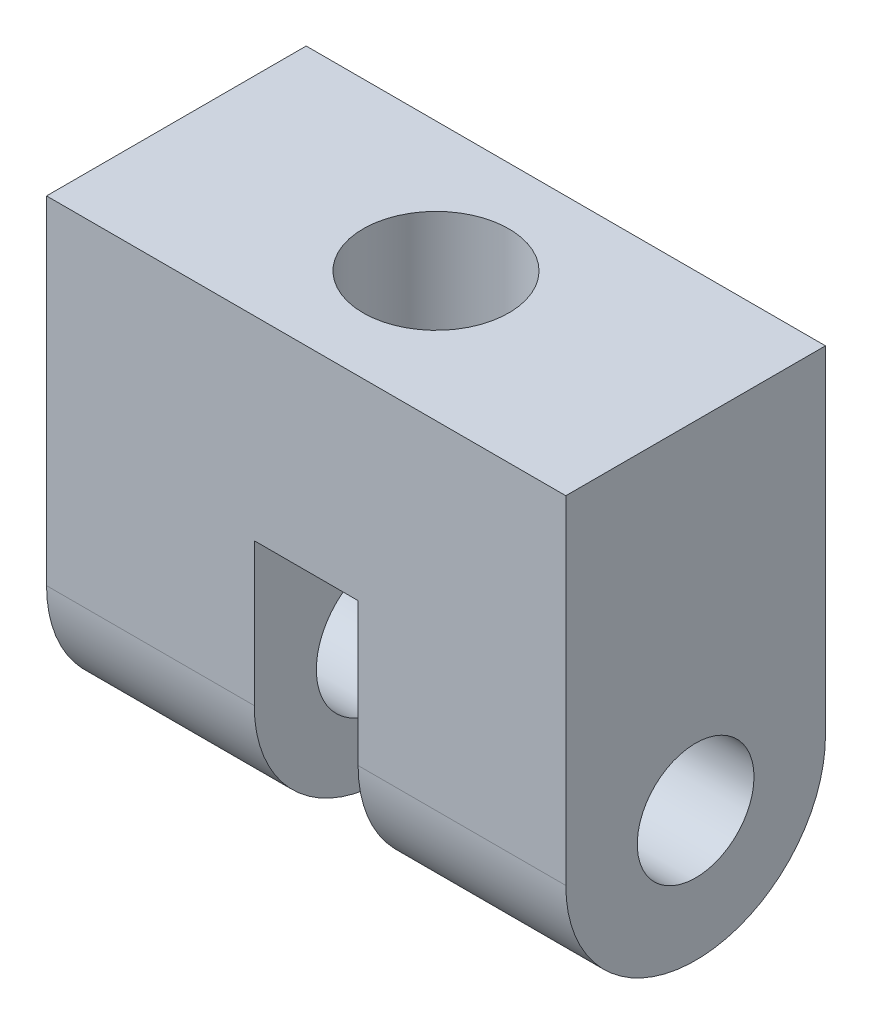
ISO-10303-21;
HEADER;
FILE_DESCRIPTION(('STEP AP214'),'2;1');
FILE_NAME('part.step','',(''),(''),'','','');
FILE_SCHEMA(('AUTOMOTIVE_DESIGN { 1 0 10303 214 1 1 1 1 }'));
ENDSEC;
DATA;
#1=APPLICATION_CONTEXT('core data for automotive mechanical design processes');
#2=APPLICATION_PROTOCOL_DEFINITION('international standard','automotive_design',2000,#1);
#3=PRODUCT_CONTEXT('',#1,'mechanical');
#4=PRODUCT('Part','Part','',(#3));
#5=PRODUCT_RELATED_PRODUCT_CATEGORY('part','',(#4));
#6=PRODUCT_DEFINITION_FORMATION('','',#4);
#7=PRODUCT_DEFINITION_CONTEXT('part definition',#1,'design');
#8=PRODUCT_DEFINITION('design','',#6,#7);
#9=PRODUCT_DEFINITION_SHAPE('','',#8);
#10=(LENGTH_UNIT() NAMED_UNIT(*) SI_UNIT(.MILLI.,.METRE.));
#11=(NAMED_UNIT(*) PLANE_ANGLE_UNIT() SI_UNIT($,.RADIAN.));
#12=(NAMED_UNIT(*) SI_UNIT($,.STERADIAN.) SOLID_ANGLE_UNIT());
#13=UNCERTAINTY_MEASURE_WITH_UNIT(LENGTH_MEASURE(1.E-05),#10,'distance_accuracy_value','');
#14=(GEOMETRIC_REPRESENTATION_CONTEXT(3) GLOBAL_UNCERTAINTY_ASSIGNED_CONTEXT((#13)) GLOBAL_UNIT_ASSIGNED_CONTEXT((#10,
#11,#12)) REPRESENTATION_CONTEXT('',''));
#15=CARTESIAN_POINT('',(0.,0.,0.));
#16=DIRECTION('',(0.,0.,1.));
#17=DIRECTION('',(1.,0.,0.));
#18=AXIS2_PLACEMENT_3D('',#15,#16,#17);
#19=CARTESIAN_POINT('',(2.,5.,0.));
#20=DIRECTION('',(1.,0.,0.));
#21=DIRECTION('',(0.,0.,-1.));
#22=AXIS2_PLACEMENT_3D('',#19,#20,#21);
#23=CYLINDRICAL_SURFACE('',#22,5.);
#24=DIRECTION('',(-1.,0.,0.));
#25=VECTOR('',#24,1.);
#26=CARTESIAN_POINT('',(2.,5.,5.));
#27=LINE('',#26,#25);
#28=CARTESIAN_POINT('',(2.,5.,5.));
#29=VERTEX_POINT('',#28);
#30=CARTESIAN_POINT('',(10.,5.,5.));
#31=VERTEX_POINT('',#30);
#32=EDGE_CURVE('E162',#29,#31,#27,.F.);
#33=ORIENTED_EDGE('',*,*,#32,.F.);
#34=CARTESIAN_POINT('',(2.,5.,0.));
#35=DIRECTION('',(1.,0.,0.));
#36=DIRECTION('',(0.,1.,0.));
#37=AXIS2_PLACEMENT_3D('',#34,#35,#36);
#38=CIRCLE('',#37,5.);
#39=CARTESIAN_POINT('',(2.,5.,-5.));
#40=VERTEX_POINT('',#39);
#41=EDGE_CURVE('E43',#40,#29,#38,.F.);
#42=ORIENTED_EDGE('',*,*,#41,.F.);
#43=DIRECTION('',(-1.,0.,0.));
#44=VECTOR('',#43,1.);
#45=CARTESIAN_POINT('',(2.,5.,-5.));
#46=LINE('',#45,#44);
#47=CARTESIAN_POINT('',(10.,5.,-5.));
#48=VERTEX_POINT('',#47);
#49=EDGE_CURVE('E165',#48,#40,#46,.T.);
#50=ORIENTED_EDGE('',*,*,#49,.F.);
#51=CARTESIAN_POINT('',(10.,5.,0.));
#52=DIRECTION('',(-1.,0.,0.));
#53=DIRECTION('',(0.,0.,1.));
#54=AXIS2_PLACEMENT_3D('',#51,#52,#53);
#55=CIRCLE('',#54,5.);
#56=EDGE_CURVE('E11',#31,#48,#55,.F.);
#57=ORIENTED_EDGE('',*,*,#56,.F.);
#58=EDGE_LOOP('',(#33,#42,#50,#57));
#59=FACE_BOUND('',#58,.T.);
#60=ADVANCED_FACE('F35',(#59),#23,.T.);
#61=CARTESIAN_POINT('',(-10.,5.,0.));
#62=DIRECTION('',(1.,0.,0.));
#63=DIRECTION('',(0.,0.,-1.));
#64=AXIS2_PLACEMENT_3D('',#61,#62,#63);
#65=CYLINDRICAL_SURFACE('',#64,5.);
#66=DIRECTION('',(-1.,0.,0.));
#67=VECTOR('',#66,1.);
#68=CARTESIAN_POINT('',(-10.,5.,5.));
#69=LINE('',#68,#67);
#70=CARTESIAN_POINT('',(-10.,5.,5.));
#71=VERTEX_POINT('',#70);
#72=CARTESIAN_POINT('',(-2.,5.,5.));
#73=VERTEX_POINT('',#72);
#74=EDGE_CURVE('E145',#71,#73,#69,.F.);
#75=ORIENTED_EDGE('',*,*,#74,.F.);
#76=CARTESIAN_POINT('',(-10.,5.,0.));
#77=DIRECTION('',(1.,0.,0.));
#78=DIRECTION('',(0.,0.,-1.));
#79=AXIS2_PLACEMENT_3D('',#76,#77,#78);
#80=CIRCLE('',#79,5.);
#81=CARTESIAN_POINT('',(-10.,5.,-5.));
#82=VERTEX_POINT('',#81);
#83=EDGE_CURVE('E160',#82,#71,#80,.F.);
#84=ORIENTED_EDGE('',*,*,#83,.F.);
#85=DIRECTION('',(-1.,0.,0.));
#86=VECTOR('',#85,1.);
#87=CARTESIAN_POINT('',(-10.,5.,-5.));
#88=LINE('',#87,#86);
#89=CARTESIAN_POINT('',(-2.,5.,-5.));
#90=VERTEX_POINT('',#89);
#91=EDGE_CURVE('E157',#90,#82,#88,.T.);
#92=ORIENTED_EDGE('',*,*,#91,.F.);
#93=CARTESIAN_POINT('',(-2.,5.,0.));
#94=DIRECTION('',(-1.,0.,0.));
#95=DIRECTION('',(0.,-1.,0.));
#96=AXIS2_PLACEMENT_3D('',#93,#94,#95);
#97=CIRCLE('',#96,5.);
#98=EDGE_CURVE('E154',#73,#90,#97,.F.);
#99=ORIENTED_EDGE('',*,*,#98,.F.);
#100=EDGE_LOOP('',(#75,#84,#92,#99));
#101=FACE_BOUND('',#100,.T.);
#102=ADVANCED_FACE('F262',(#101),#65,.T.);
#103=CARTESIAN_POINT('',(2.,10.5,-5.));
#104=DIRECTION('',(0.,1.,0.));
#105=DIRECTION('',(0.,0.,1.));
#106=AXIS2_PLACEMENT_3D('',#103,#104,#105);
#107=PLANE('',#106);
#108=DIRECTION('',(0.,0.,1.));
#109=VECTOR('',#108,1.);
#110=CARTESIAN_POINT('',(2.,10.5,-5.));
#111=LINE('',#110,#109);
#112=CARTESIAN_POINT('',(2.,10.5,-5.));
#113=VERTEX_POINT('',#112);
#114=CARTESIAN_POINT('',(2.,10.5,-1.96915334344484));
#115=VERTEX_POINT('',#114);
#116=EDGE_CURVE('E197',#113,#115,#111,.T.);
#117=ORIENTED_EDGE('',*,*,#116,.T.);
#118=CARTESIAN_POINT('',(0.,10.5,0.));
#119=DIRECTION('',(0.,1.,0.));
#120=DIRECTION('',(0.,0.,1.));
#121=AXIS2_PLACEMENT_3D('',#118,#119,#120);
#122=CIRCLE('',#121,2.8067);
#123=CARTESIAN_POINT('',(-2.,10.5,-1.96915334344484));
#124=VERTEX_POINT('',#123);
#125=EDGE_CURVE('E310',#115,#124,#122,.T.);
#126=ORIENTED_EDGE('',*,*,#125,.T.);
#127=DIRECTION('',(0.,0.,1.));
#128=VECTOR('',#127,1.);
#129=CARTESIAN_POINT('',(-2.,10.5,-5.));
#130=LINE('',#129,#128);
#131=CARTESIAN_POINT('',(-2.,10.5,-5.));
#132=VERTEX_POINT('',#131);
#133=EDGE_CURVE('E192',#132,#124,#130,.T.);
#134=ORIENTED_EDGE('',*,*,#133,.F.);
#135=DIRECTION('',(-1.,0.,0.));
#136=VECTOR('',#135,1.);
#137=CARTESIAN_POINT('',(2.,10.5,-5.));
#138=LINE('',#137,#136);
#139=EDGE_CURVE('E189',#113,#132,#138,.T.);
#140=ORIENTED_EDGE('',*,*,#139,.F.);
#141=EDGE_LOOP('',(#117,#126,#134,#140));
#142=FACE_BOUND('',#141,.T.);
#143=ADVANCED_FACE('F252',(#142),#107,.F.);
#144=CARTESIAN_POINT('',(10.,18.,5.));
#145=DIRECTION('',(-1.,0.,0.));
#146=DIRECTION('',(0.,0.,1.));
#147=AXIS2_PLACEMENT_3D('',#144,#145,#146);
#148=PLANE('',#147);
#149=CARTESIAN_POINT('',(10.,5.,0.));
#150=DIRECTION('',(1.,0.,0.));
#151=DIRECTION('',(0.,0.,-1.));
#152=AXIS2_PLACEMENT_3D('',#149,#150,#151);
#153=CIRCLE('',#152,2.2479);
#154=CARTESIAN_POINT('',(10.,5.,-2.2479));
#155=VERTEX_POINT('',#154);
#156=EDGE_CURVE('E318',#155,#155,#153,.T.);
#157=ORIENTED_EDGE('',*,*,#156,.F.);
#158=EDGE_LOOP('',(#157));
#159=FACE_BOUND('',#158,.T.);
#160=DIRECTION('',(0.,-1.,0.));
#161=VECTOR('',#160,1.);
#162=CARTESIAN_POINT('',(10.,18.,5.));
#163=LINE('',#162,#161);
#164=CARTESIAN_POINT('',(10.,18.,5.));
#165=VERTEX_POINT('',#164);
#166=EDGE_CURVE('E208',#165,#31,#163,.T.);
#167=ORIENTED_EDGE('',*,*,#166,.T.);
#168=ORIENTED_EDGE('',*,*,#56,.T.);
#169=DIRECTION('',(0.,-1.,0.));
#170=VECTOR('',#169,1.);
#171=CARTESIAN_POINT('',(10.,18.,-5.));
#172=LINE('',#171,#170);
#173=CARTESIAN_POINT('',(10.,18.,-5.));
#174=VERTEX_POINT('',#173);
#175=EDGE_CURVE('E216',#174,#48,#172,.T.);
#176=ORIENTED_EDGE('',*,*,#175,.F.);
#177=DIRECTION('',(0.,0.,-1.));
#178=VECTOR('',#177,1.);
#179=CARTESIAN_POINT('',(10.,18.,5.));
#180=LINE('',#179,#178);
#181=EDGE_CURVE('E195',#165,#174,#180,.T.);
#182=ORIENTED_EDGE('',*,*,#181,.F.);
#183=EDGE_LOOP('',(#167,#168,#176,#182));
#184=FACE_BOUND('',#183,.T.);
#185=ADVANCED_FACE('F270',(#159,#184),#148,.F.);
#186=CARTESIAN_POINT('',(-10.,18.,-5.));
#187=DIRECTION('',(0.,0.,1.));
#188=DIRECTION('',(1.,0.,0.));
#189=AXIS2_PLACEMENT_3D('',#186,#187,#188);
#190=PLANE('',#189);
#191=ORIENTED_EDGE('',*,*,#175,.T.);
#192=ORIENTED_EDGE('',*,*,#49,.T.);
#193=DIRECTION('',(0.,1.,0.));
#194=VECTOR('',#193,1.);
#195=CARTESIAN_POINT('',(2.,10.5,-5.));
#196=LINE('',#195,#194);
#197=EDGE_CURVE('E169',#40,#113,#196,.T.);
#198=ORIENTED_EDGE('',*,*,#197,.T.);
#199=ORIENTED_EDGE('',*,*,#139,.T.);
#200=DIRECTION('',(0.,-1.,0.));
#201=VECTOR('',#200,1.);
#202=CARTESIAN_POINT('',(-2.,10.5,-5.));
#203=LINE('',#202,#201);
#204=EDGE_CURVE('E179',#132,#90,#203,.T.);
#205=ORIENTED_EDGE('',*,*,#204,.T.);
#206=ORIENTED_EDGE('',*,*,#91,.T.);
#207=DIRECTION('',(0.,-1.,0.));
#208=VECTOR('',#207,1.);
#209=CARTESIAN_POINT('',(-10.,18.,-5.));
#210=LINE('',#209,#208);
#211=CARTESIAN_POINT('',(-10.,18.,-5.));
#212=VERTEX_POINT('',#211);
#213=EDGE_CURVE('E213',#212,#82,#210,.T.);
#214=ORIENTED_EDGE('',*,*,#213,.F.);
#215=DIRECTION('',(-1.,0.,0.));
#216=VECTOR('',#215,1.);
#217=CARTESIAN_POINT('',(-10.,18.,-5.));
#218=LINE('',#217,#216);
#219=EDGE_CURVE('E202',#174,#212,#218,.T.);
#220=ORIENTED_EDGE('',*,*,#219,.F.);
#221=EDGE_LOOP('',(#191,#192,#198,#199,#205,#206,#214,#220));
#222=FACE_BOUND('',#221,.T.);
#223=ADVANCED_FACE('F279',(#222),#190,.F.);
#224=CARTESIAN_POINT('',(-10.,18.,5.));
#225=DIRECTION('',(1.,0.,0.));
#226=DIRECTION('',(0.,0.,-1.));
#227=AXIS2_PLACEMENT_3D('',#224,#225,#226);
#228=PLANE('',#227);
#229=CARTESIAN_POINT('',(-10.,5.,0.));
#230=DIRECTION('',(1.,0.,0.));
#231=DIRECTION('',(0.,0.,-1.));
#232=AXIS2_PLACEMENT_3D('',#229,#230,#231);
#233=CIRCLE('',#232,2.60985);
#234=CARTESIAN_POINT('',(-10.,5.,-2.60985));
#235=VERTEX_POINT('',#234);
#236=EDGE_CURVE('E314',#235,#235,#233,.T.);
#237=ORIENTED_EDGE('',*,*,#236,.T.);
#238=EDGE_LOOP('',(#237));
#239=FACE_BOUND('',#238,.T.);
#240=ORIENTED_EDGE('',*,*,#213,.T.);
#241=ORIENTED_EDGE('',*,*,#83,.T.);
#242=DIRECTION('',(0.,-1.,0.));
#243=VECTOR('',#242,1.);
#244=CARTESIAN_POINT('',(-10.,18.,5.));
#245=LINE('',#244,#243);
#246=CARTESIAN_POINT('',(-10.,18.,5.));
#247=VERTEX_POINT('',#246);
#248=EDGE_CURVE('E210',#247,#71,#245,.T.);
#249=ORIENTED_EDGE('',*,*,#248,.F.);
#250=DIRECTION('',(0.,0.,1.));
#251=VECTOR('',#250,1.);
#252=CARTESIAN_POINT('',(-10.,18.,5.));
#253=LINE('',#252,#251);
#254=EDGE_CURVE('E204',#212,#247,#253,.T.);
#255=ORIENTED_EDGE('',*,*,#254,.F.);
#256=EDGE_LOOP('',(#240,#241,#249,#255));
#257=FACE_BOUND('',#256,.T.);
#258=ADVANCED_FACE('F283',(#239,#257),#228,.F.);
#259=CARTESIAN_POINT('',(-10.,18.,5.));
#260=DIRECTION('',(0.,0.,-1.));
#261=DIRECTION('',(-1.,0.,0.));
#262=AXIS2_PLACEMENT_3D('',#259,#260,#261);
#263=PLANE('',#262);
#264=DIRECTION('',(0.,1.,0.));
#265=VECTOR('',#264,1.);
#266=CARTESIAN_POINT('',(2.,10.5,5.));
#267=LINE('',#266,#265);
#268=CARTESIAN_POINT('',(2.,10.5,5.));
#269=VERTEX_POINT('',#268);
#270=EDGE_CURVE('E167',#29,#269,#267,.T.);
#271=ORIENTED_EDGE('',*,*,#270,.F.);
#272=ORIENTED_EDGE('',*,*,#32,.T.);
#273=ORIENTED_EDGE('',*,*,#166,.F.);
#274=DIRECTION('',(1.,0.,0.));
#275=VECTOR('',#274,1.);
#276=CARTESIAN_POINT('',(-10.,18.,5.));
#277=LINE('',#276,#275);
#278=EDGE_CURVE('E206',#247,#165,#277,.T.);
#279=ORIENTED_EDGE('',*,*,#278,.F.);
#280=ORIENTED_EDGE('',*,*,#248,.T.);
#281=ORIENTED_EDGE('',*,*,#74,.T.);
#282=DIRECTION('',(0.,-1.,0.));
#283=VECTOR('',#282,1.);
#284=CARTESIAN_POINT('',(-2.,10.5,5.));
#285=LINE('',#284,#283);
#286=CARTESIAN_POINT('',(-2.,10.5,5.));
#287=VERTEX_POINT('',#286);
#288=EDGE_CURVE('E177',#287,#73,#285,.T.);
#289=ORIENTED_EDGE('',*,*,#288,.F.);
#290=DIRECTION('',(-1.,0.,0.));
#291=VECTOR('',#290,1.);
#292=CARTESIAN_POINT('',(2.,10.5,5.));
#293=LINE('',#292,#291);
#294=EDGE_CURVE('E176',#269,#287,#293,.T.);
#295=ORIENTED_EDGE('',*,*,#294,.F.);
#296=EDGE_LOOP('',(#271,#272,#273,#279,#280,#281,#289,#295));
#297=FACE_BOUND('',#296,.T.);
#298=ADVANCED_FACE('F173',(#297),#263,.F.);
#299=CARTESIAN_POINT('',(0.,18.,0.));
#300=DIRECTION('',(0.,-1.,0.));
#301=DIRECTION('',(0.,0.,-1.));
#302=AXIS2_PLACEMENT_3D('',#299,#300,#301);
#303=PLANE('',#302);
#304=CARTESIAN_POINT('',(0.,18.,0.));
#305=DIRECTION('',(0.,1.,0.));
#306=DIRECTION('',(0.,0.,1.));
#307=AXIS2_PLACEMENT_3D('',#304,#305,#306);
#308=CIRCLE('',#307,2.8067);
#309=CARTESIAN_POINT('',(0.,18.,2.8067));
#310=VERTEX_POINT('',#309);
#311=EDGE_CURVE('E299',#310,#310,#308,.T.);
#312=ORIENTED_EDGE('',*,*,#311,.F.);
#313=EDGE_LOOP('',(#312));
#314=FACE_BOUND('',#313,.T.);
#315=ORIENTED_EDGE('',*,*,#181,.T.);
#316=ORIENTED_EDGE('',*,*,#219,.T.);
#317=ORIENTED_EDGE('',*,*,#254,.T.);
#318=ORIENTED_EDGE('',*,*,#278,.T.);
#319=EDGE_LOOP('',(#315,#316,#317,#318));
#320=FACE_BOUND('',#319,.T.);
#321=ADVANCED_FACE('F289',(#314,#320),#303,.F.);
#322=CARTESIAN_POINT('',(-2.,10.5,-5.));
#323=DIRECTION('',(-1.,0.,0.));
#324=DIRECTION('',(0.,-1.,0.));
#325=AXIS2_PLACEMENT_3D('',#322,#323,#324);
#326=PLANE('',#325);
#327=CARTESIAN_POINT('',(-2.,5.,0.));
#328=DIRECTION('',(1.,0.,0.));
#329=DIRECTION('',(0.,0.,-1.));
#330=AXIS2_PLACEMENT_3D('',#327,#328,#329);
#331=CIRCLE('',#330,2.60985);
#332=CARTESIAN_POINT('',(-2.,5.,-2.60985));
#333=VERTEX_POINT('',#332);
#334=EDGE_CURVE('E312',#333,#333,#331,.T.);
#335=ORIENTED_EDGE('',*,*,#334,.F.);
#336=EDGE_LOOP('',(#335));
#337=FACE_BOUND('',#336,.T.);
#338=ORIENTED_EDGE('',*,*,#288,.T.);
#339=ORIENTED_EDGE('',*,*,#98,.T.);
#340=ORIENTED_EDGE('',*,*,#204,.F.);
#341=ORIENTED_EDGE('',*,*,#133,.T.);
#342=DIRECTION('',(0.,1.,0.));
#343=VECTOR('',#342,1.);
#344=CARTESIAN_POINT('',(-2.,18.,-1.96915334344484));
#345=LINE('',#344,#343);
#346=CARTESIAN_POINT('',(-2.,9.872,-1.96915334344484));
#347=VERTEX_POINT('',#346);
#348=EDGE_CURVE('E148',#124,#347,#345,.F.);
#349=ORIENTED_EDGE('',*,*,#348,.T.);
#350=CARTESIAN_POINT('',(-2.,16.6406719130578,-13.9288070367283));
#351=CARTESIAN_POINT('',(-2.,16.3985514406771,-13.5216999821716));
#352=CARTESIAN_POINT('',(-2.,16.1565741946182,-13.1145075527468));
#353=CARTESIAN_POINT('',(-2.,15.6729327257234,-12.299694740552));
#354=CARTESIAN_POINT('',(-2.,15.431268687297,-11.8920742483373));
#355=CARTESIAN_POINT('',(-2.,14.9465613088637,-11.0732421038252));
#356=CARTESIAN_POINT('',(-2.,14.7035224106274,-10.662027821372));
#357=CARTESIAN_POINT('',(-2.,14.2183338936806,-9.83931642335012));
#358=CARTESIAN_POINT('',(-2.,13.9761839332821,-9.42781950942103));
#359=CARTESIAN_POINT('',(-2.,13.5571172644711,-8.71341922266092));
#360=CARTESIAN_POINT('',(-2.,13.3799382375777,-8.41066978853155));
#361=CARTESIAN_POINT('',(-2.,13.0264115465257,-7.80466753336444));
#362=CARTESIAN_POINT('',(-2.,12.8500639198118,-7.50141469047024));
#363=CARTESIAN_POINT('',(-2.,12.4982701149865,-6.89375378546589));
#364=CARTESIAN_POINT('',(-2.,12.3228257724832,-6.58934465918273));
#365=CARTESIAN_POINT('',(-2.,11.973698097773,-5.97958533570648));
#366=CARTESIAN_POINT('',(-2.,11.800014474475,-5.67423530532328));
#367=CARTESIAN_POINT('',(-2.,11.4564200925007,-5.0640302617937));
#368=CARTESIAN_POINT('',(-2.,11.2864921236234,-4.75918498894272));
#369=CARTESIAN_POINT('',(-2.,11.0348253257584,-4.30001254334722));
#370=CARTESIAN_POINT('',(-2.,10.9514462501742,-4.14658539665578));
#371=CARTESIAN_POINT('',(-2.,10.7861668801709,-3.83894184704615));
#372=CARTESIAN_POINT('',(-2.,10.7042665321032,-3.68472547302295));
#373=CARTESIAN_POINT('',(-2.,10.5427160865669,-3.3757069030644));
#374=CARTESIAN_POINT('',(-2.,10.4630599548776,-3.22090787024746));
#375=CARTESIAN_POINT('',(-2.,10.3065328786837,-2.90986682910219));
#376=CARTESIAN_POINT('',(-2.,10.2296623943585,-2.75362458766235));
#377=CARTESIAN_POINT('',(-2.,10.0800745768447,-2.43937998512475));
#378=CARTESIAN_POINT('',(-2.,10.0073525005274,-2.28137989145426));
#379=CARTESIAN_POINT('',(-2.,9.86800619308229,-1.9627253153707));
#380=CARTESIAN_POINT('',(-2.,9.80137948943865,-1.80207194072886));
#381=CARTESIAN_POINT('',(-2.,9.72892007368692,-1.61184049796109));
#382=CARTESIAN_POINT('',(-2.,9.71847895848792,-1.58401189148512));
#383=CARTESIAN_POINT('',(-2.,9.69790028301456,-1.52824115376452));
#384=CARTESIAN_POINT('',(-2.,9.68776273700594,-1.50029901725458));
#385=CARTESIAN_POINT('',(-2.,9.65783864697472,-1.4162926159855));
#386=CARTESIAN_POINT('',(-2.,9.63854225184907,-1.36005254209951));
#387=CARTESIAN_POINT('',(-2.,9.6014764018869,-1.24707837320379));
#388=CARTESIAN_POINT('',(-2.,9.58370670619231,-1.19034435768138));
#389=CARTESIAN_POINT('',(-2.,9.54993866681397,-1.07635356740047));
#390=CARTESIAN_POINT('',(-2.,9.53394031832473,-1.01909679406061));
#391=CARTESIAN_POINT('',(-2.,9.48983551081513,-0.849693326400535));
#392=CARTESIAN_POINT('',(-2.,9.46456439373223,-0.736779684411414));
#393=CARTESIAN_POINT('',(-2.,9.42389966228019,-0.509142272323795));
#394=CARTESIAN_POINT('',(-2.,9.40850562491976,-0.394418579957301));
#395=CARTESIAN_POINT('',(-2.,9.3894206339338,-0.164564914361269));
#396=CARTESIAN_POINT('',(-2.,9.3856688758702,-0.0494402065647753));
#397=CARTESIAN_POINT('',(-2.,9.39019290321129,0.180527925020471));
#398=CARTESIAN_POINT('',(-2.,9.39846547704792,0.295371415713728));
#399=CARTESIAN_POINT('',(-2.,9.42628684731391,0.52627472124992));
#400=CARTESIAN_POINT('',(-2.,9.4460857338512,0.64230355948891));
#401=CARTESIAN_POINT('',(-2.,9.4827864247219,0.814818146979209));
#402=CARTESIAN_POINT('',(-2.,9.49619262554693,0.872086864119194));
#403=CARTESIAN_POINT('',(-2.,9.52505674471133,0.986103525984001));
#404=CARTESIAN_POINT('',(-2.,9.54051455492958,1.04285149798404));
#405=CARTESIAN_POINT('',(-2.,9.58447983539814,1.19476122959919));
#406=CARTESIAN_POINT('',(-2.,9.61463904031813,1.28944420332208));
#407=CARTESIAN_POINT('',(-2.,9.67890991159619,1.47746867857403));
#408=CARTESIAN_POINT('',(-2.,9.7130227070323,1.57080978829267));
#409=CARTESIAN_POINT('',(-2.,9.7843344228103,1.75640357575549));
#410=CARTESIAN_POINT('',(-2.,9.82153635530858,1.8486550885475));
#411=CARTESIAN_POINT('',(-2.,9.89832048545573,2.0321657543122));
#412=CARTESIAN_POINT('',(-2.,9.93790290742691,2.12342481280241));
#413=CARTESIAN_POINT('',(-2.,10.0597860173995,2.39680366676195));
#414=CARTESIAN_POINT('',(-2.,10.1448835614502,2.57767334202961));
#415=CARTESIAN_POINT('',(-2.,10.3196802484306,2.93701481277268));
#416=CARTESIAN_POINT('',(-2.,10.4093767561329,3.11548790912096));
#417=CARTESIAN_POINT('',(-2.,10.5834783707956,3.4544847076198));
#418=CARTESIAN_POINT('',(-2.,10.6676108737418,3.61514886340381));
#419=CARTESIAN_POINT('',(-2.,10.8377205531125,3.93552754331566));
#420=CARTESIAN_POINT('',(-2.,10.9236980235643,4.09524191082028));
#421=CARTESIAN_POINT('',(-2.,11.0961127933418,4.41231495305982));
#422=CARTESIAN_POINT('',(-2.,11.1825364774314,4.56968104736795));
#423=CARTESIAN_POINT('',(-2.,11.3563805494476,4.88381806849676));
#424=CARTESIAN_POINT('',(-2.,11.4438007196488,5.04058911571798));
#425=CARTESIAN_POINT('',(-2.,11.5315783008187,5.19715722776736));
#426=B_SPLINE_CURVE_WITH_KNOTS('',3,(#350,#351,#352,#353,#354,#355,#356,#357,#358,#359,#360,
#361,#362,#363,#364,#365,#366,#367,#368,#369,#370,#371,#372,#373,#374,#375,#376,#377,#378,#379,
#380,#381,#382,#383,#384,#385,#386,#387,#388,#389,#390,#391,#392,#393,#394,#395,#396,#397,#398,
#399,#400,#401,#402,#403,#404,#405,#406,#407,#408,#409,#410,#411,#412,#413,#414,#415,#416,#417,
#418,#419,#420,#421,#422,#423,#424,#425),.UNSPECIFIED.,.F.,.F.,(4,2,2,2,2,2,2,2,2,2,2,2,2,2,2,2,
2,2,2,2,2,2,2,2,2,2,2,2,2,2,2,2,2,2,2,2,2,4),(0.,1.42099505014508,2.84261488512406,
4.27561321197848,5.70798640727876,6.76033834294856,7.81273723034798,8.86677799673851,
9.92064156475211,10.9676377954346,11.4914905723126,12.0153243053129,12.5375804068403,
13.0599223935849,13.5816546639063,14.1031743525297,14.1923414796069,14.2815127903967,
14.4598688443858,14.6381967083602,14.8165240885386,15.1632781507844,15.5100173621084,
15.8549425751451,16.1997756793422,16.552385336572,16.7288065594591,16.9052184885248,
17.2032067485122,17.501280319541,17.7996480282365,18.0980438974132,18.6975835204598,
19.2967833623986,19.8408449764389,20.3849939496387,20.923597549271,21.4620856413094),.UNSPECIFIED.);
#427=CARTESIAN_POINT('',(-2.,9.872,1.96915334344484));
#428=VERTEX_POINT('',#427);
#429=EDGE_CURVE('E219',#347,#428,#426,.T.);
#430=ORIENTED_EDGE('',*,*,#429,.T.);
#431=DIRECTION('',(0.,1.,0.));
#432=VECTOR('',#431,1.);
#433=CARTESIAN_POINT('',(-2.,18.,1.96915334344484));
#434=LINE('',#433,#432);
#435=CARTESIAN_POINT('',(-2.,10.5,1.96915334344484));
#436=VERTEX_POINT('',#435);
#437=EDGE_CURVE('E143',#428,#436,#434,.T.);
#438=ORIENTED_EDGE('',*,*,#437,.T.);
#439=EDGE_CURVE('E196',#436,#287,#130,.T.);
#440=ORIENTED_EDGE('',*,*,#439,.T.);
#441=EDGE_LOOP('',(#338,#339,#340,#341,#349,#430,#438,#440));
#442=FACE_BOUND('',#441,.T.);
#443=ADVANCED_FACE('F226',(#337,#442),#326,.F.);
#444=ORIENTED_EDGE('',*,*,#439,.F.);
#445=CARTESIAN_POINT('',(2.,10.5,1.96915334344484));
#446=VERTEX_POINT('',#445);
#447=EDGE_CURVE('E129',#436,#446,#122,.T.);
#448=ORIENTED_EDGE('',*,*,#447,.T.);
#449=EDGE_CURVE('E142',#446,#269,#111,.T.);
#450=ORIENTED_EDGE('',*,*,#449,.T.);
#451=ORIENTED_EDGE('',*,*,#294,.T.);
#452=EDGE_LOOP('',(#444,#448,#450,#451));
#453=FACE_BOUND('',#452,.T.);
#454=ADVANCED_FACE('F248',(#453),#107,.F.);
#455=CARTESIAN_POINT('',(2.,10.5,-5.));
#456=DIRECTION('',(1.,0.,0.));
#457=DIRECTION('',(0.,1.,0.));
#458=AXIS2_PLACEMENT_3D('',#455,#456,#457);
#459=PLANE('',#458);
#460=CARTESIAN_POINT('',(2.,5.,0.));
#461=DIRECTION('',(1.,0.,0.));
#462=DIRECTION('',(0.,1.,0.));
#463=AXIS2_PLACEMENT_3D('',#460,#461,#462);
#464=CIRCLE('',#463,2.2479);
#465=CARTESIAN_POINT('',(2.,7.2479,0.));
#466=VERTEX_POINT('',#465);
#467=EDGE_CURVE('E182',#466,#466,#464,.T.);
#468=ORIENTED_EDGE('',*,*,#467,.T.);
#469=EDGE_LOOP('',(#468));
#470=FACE_BOUND('',#469,.T.);
#471=ORIENTED_EDGE('',*,*,#197,.F.);
#472=ORIENTED_EDGE('',*,*,#41,.T.);
#473=ORIENTED_EDGE('',*,*,#270,.T.);
#474=ORIENTED_EDGE('',*,*,#449,.F.);
#475=DIRECTION('',(0.,1.,0.));
#476=VECTOR('',#475,1.);
#477=CARTESIAN_POINT('',(2.,18.,1.96915334344484));
#478=LINE('',#477,#476);
#479=CARTESIAN_POINT('',(2.,9.872,1.96915334344484));
#480=VERTEX_POINT('',#479);
#481=EDGE_CURVE('E133',#446,#480,#478,.F.);
#482=ORIENTED_EDGE('',*,*,#481,.T.);
#483=CARTESIAN_POINT('',(2.,16.6406719260221,-13.9288070585258));
#484=CARTESIAN_POINT('',(2.,16.3985514537183,-13.5217000041114));
#485=CARTESIAN_POINT('',(2.,16.1565742077355,-13.1145075748293));
#486=CARTESIAN_POINT('',(2.,15.672932738991,-12.2996947629219));
#487=CARTESIAN_POINT('',(2.,15.4312687006386,-11.8920742708519));
#488=CARTESIAN_POINT('',(2.,14.9465613223611,-11.0732421266505));
#489=CARTESIAN_POINT('',(2.,14.7035224242064,-10.6620278443634));
#490=CARTESIAN_POINT('',(2.,14.2183339074169,-9.83931644667638));
#491=CARTESIAN_POINT('',(2.,13.9761839470942,-9.42781953291614));
#492=CARTESIAN_POINT('',(2.,13.5571172778156,-8.71341924544719));
#493=CARTESIAN_POINT('',(2.,13.3799382503835,-8.41066981043767));
#494=CARTESIAN_POINT('',(2.,13.0264115582524,-7.80466755351095));
#495=CARTESIAN_POINT('',(2.,12.8500639309982,-7.50141470973729));
#496=CARTESIAN_POINT('',(2.,12.4982701250902,-6.89375380297402));
#497=CARTESIAN_POINT('',(2.,12.3228257820445,-6.58934467581142));
#498=CARTESIAN_POINT('',(2.,11.9736981062473,-5.97958535057745));
#499=CARTESIAN_POINT('',(2.,11.8000144824049,-5.67423531931598));
#500=CARTESIAN_POINT('',(2.,11.4564200993396,-5.0640302740304));
#501=CARTESIAN_POINT('',(2.,11.2864921299157,-4.75918500030166));
#502=CARTESIAN_POINT('',(2.,11.0348253312294,-4.30001255338909));
#503=CARTESIAN_POINT('',(2.,10.951446255371,-4.14658540625836));
#504=CARTESIAN_POINT('',(2.,10.7861668848195,-3.83894185576986));
#505=CARTESIAN_POINT('',(2.,10.7042665364777,-3.68472548130706));
#506=CARTESIAN_POINT('',(2.,10.5427160903947,-3.37570691046964));
#507=CARTESIAN_POINT('',(2.,10.4630599584328,-3.22090787721344));
#508=CARTESIAN_POINT('',(2.,10.3065328816961,-2.90986683518735));
#509=CARTESIAN_POINT('',(2.,10.2296623971007,-2.75362459330596));
#510=CARTESIAN_POINT('',(2.,10.0800745790532,-2.4393799898815));
#511=CARTESIAN_POINT('',(2.,10.0073525024723,-2.28137989576571));
#512=CARTESIAN_POINT('',(2.,9.86800619451462,-1.962725318783));
#513=CARTESIAN_POINT('',(2.,9.80137949062189,-1.80207194368731));
#514=CARTESIAN_POINT('',(2.,9.72892007450397,-1.61184050013111));
#515=CARTESIAN_POINT('',(2.,9.71847895917398,-1.58401189332754));
#516=CARTESIAN_POINT('',(2.,9.69790028344542,-1.52824115494913));
#517=CARTESIAN_POINT('',(2.,9.6877627373126,-1.500299018109));
#518=CARTESIAN_POINT('',(2.,9.65783864692013,-1.41629261584515));
#519=CARTESIAN_POINT('',(2.,9.63854225156882,-1.36005254129046));
#520=CARTESIAN_POINT('',(2.,9.60147640119356,-1.24707837104543));
#521=CARTESIAN_POINT('',(2.,9.58370670531156,-1.19034435484241));
#522=CARTESIAN_POINT('',(2.,9.54993866560571,-1.07635356318753));
#523=CARTESIAN_POINT('',(2.,9.53394031697639,-1.01909678915431));
#524=CARTESIAN_POINT('',(2.,9.4898355091548,-0.849693319493374));
#525=CARTESIAN_POINT('',(2.,9.46456439197584,-0.736779676179231));
#526=CARTESIAN_POINT('',(2.,9.42389966061648,-0.509142261415994));
#527=CARTESIAN_POINT('',(2.,9.40850562344451,-0.394418567698959));
#528=CARTESIAN_POINT('',(2.,9.38942063325433,-0.164564900711002));
#529=CARTESIAN_POINT('',(2.,9.38566887566763,-0.0494401928841648));
#530=CARTESIAN_POINT('',(2.,9.3901929039526,0.180527938713171));
#531=CARTESIAN_POINT('',(2.,9.39846547825648,0.295371429388182));
#532=CARTESIAN_POINT('',(2.,9.42628684940684,0.526274734883318));
#533=CARTESIAN_POINT('',(2.,9.44608573636296,0.642303573098295));
#534=CARTESIAN_POINT('',(2.,9.48278642779984,0.81481816054246));
#535=CARTESIAN_POINT('',(2.,9.4961926288032,0.872086877665029));
#536=CARTESIAN_POINT('',(2.,9.5250567483041,0.9861035394938));
#537=CARTESIAN_POINT('',(2.,9.54051455868052,1.04285151147522));
#538=CARTESIAN_POINT('',(2.,9.58447983986352,1.19476124412936));
#539=CARTESIAN_POINT('',(2.,9.61463904538001,1.28944421889375));
#540=CARTESIAN_POINT('',(2.,9.67890991788421,1.47746869620646));
#541=CARTESIAN_POINT('',(2.,9.71302271395,1.57080980694438));
#542=CARTESIAN_POINT('',(2.,9.78433443100442,1.75640359643246));
#543=CARTESIAN_POINT('',(2.,9.82153636414949,1.84865511023044));
#544=CARTESIAN_POINT('',(2.,9.89832049559717,2.03216577799819));
#545=CARTESIAN_POINT('',(2.,9.9379029182221,2.12342483748547));
#546=CARTESIAN_POINT('',(2.,10.0597860301615,2.3968036944322));
#547=CARTESIAN_POINT('',(2.,10.1448835755271,2.57767337168259));
#548=CARTESIAN_POINT('',(2.,10.3196802651255,2.93701484638605));
#549=CARTESIAN_POINT('',(2.,10.4093767741308,3.115487944712));
#550=CARTESIAN_POINT('',(2.,10.5834783910818,3.45448474662433));
#551=CARTESIAN_POINT('',(2.,10.6676108950086,3.61514890384696));
#552=CARTESIAN_POINT('',(2.,10.8377205763243,3.935527586643));
#553=CARTESIAN_POINT('',(2.,10.9236980477404,4.09524195559319));
#554=CARTESIAN_POINT('',(2.,11.096112819434,4.41231500073315));
#555=CARTESIAN_POINT('',(2.,11.1825365044759,4.56968109649599));
#556=CARTESIAN_POINT('',(2.,11.3563805783868,4.88381812053837));
#557=CARTESIAN_POINT('',(2.,11.4438007495304,5.04058916921847));
#558=CARTESIAN_POINT('',(2.,11.5315783316393,5.19715728272849));
#559=B_SPLINE_CURVE_WITH_KNOTS('',3,(#483,#484,#485,#486,#487,#488,#489,#490,#491,#492,#493,
#494,#495,#496,#497,#498,#499,#500,#501,#502,#503,#504,#505,#506,#507,#508,#509,#510,#511,#512,
#513,#514,#515,#516,#517,#518,#519,#520,#521,#522,#523,#524,#525,#526,#527,#528,#529,#530,#531,
#532,#533,#534,#535,#536,#537,#538,#539,#540,#541,#542,#543,#544,#545,#546,#547,#548,#549,#550,
#551,#552,#553,#554,#555,#556,#557,#558),.UNSPECIFIED.,.F.,.F.,(4,2,2,2,2,2,2,2,2,2,2,2,2,2,2,2,
2,2,2,2,2,2,2,2,2,2,2,2,2,2,2,2,2,2,2,2,2,4),(0.,1.4209950496603,2.84261488415265,
4.27561321045355,5.70798640520218,6.76033834396736,7.81273723446233,8.86677800395137,
9.92064157506276,10.9676378088438,11.4914905872724,12.0153243218232,12.5375804248965,
13.0599224131876,13.5816546850531,14.1031743752196,14.192341503355,14.2815128152031,
14.4598688713087,14.6381967373985,14.8165241196924,15.1632781858643,15.5100174011043,
15.8549426141839,16.1997757184307,16.5523853758081,16.7288065987669,16.9052185279041,
17.2032067914102,17.5012803659593,17.7996480781795,18.098043950881,18.6975835809907,
19.2967834299866,19.8408450492155,20.3849940276053,20.9235976324381,21.4620857296762),.UNSPECIFIED.);
#560=CARTESIAN_POINT('',(2.,9.872,-1.96915334344484));
#561=VERTEX_POINT('',#560);
#562=EDGE_CURVE('E122',#480,#561,#559,.F.);
#563=ORIENTED_EDGE('',*,*,#562,.T.);
#564=DIRECTION('',(0.,1.,0.));
#565=VECTOR('',#564,1.);
#566=CARTESIAN_POINT('',(2.,18.,-1.96915334344484));
#567=LINE('',#566,#565);
#568=EDGE_CURVE('E135',#561,#115,#567,.T.);
#569=ORIENTED_EDGE('',*,*,#568,.T.);
#570=ORIENTED_EDGE('',*,*,#116,.F.);
#571=EDGE_LOOP('',(#471,#472,#473,#474,#482,#563,#569,#570));
#572=FACE_BOUND('',#571,.T.);
#573=ADVANCED_FACE('F140',(#470,#572),#459,.F.);
#574=CARTESIAN_POINT('',(10.,5.,0.));
#575=DIRECTION('',(1.,0.,0.));
#576=DIRECTION('',(0.,0.,-1.));
#577=AXIS2_PLACEMENT_3D('',#574,#575,#576);
#578=CYLINDRICAL_SURFACE('',#577,2.2479);
#579=ORIENTED_EDGE('',*,*,#467,.F.);
#580=EDGE_LOOP('',(#579));
#581=FACE_BOUND('',#580,.T.);
#582=ORIENTED_EDGE('',*,*,#156,.T.);
#583=EDGE_LOOP('',(#582));
#584=FACE_BOUND('',#583,.T.);
#585=ADVANCED_FACE('F247',(#581,#584),#578,.F.);
#586=CARTESIAN_POINT('',(-2.,5.,0.));
#587=DIRECTION('',(1.,0.,0.));
#588=DIRECTION('',(0.,0.,-1.));
#589=AXIS2_PLACEMENT_3D('',#586,#587,#588);
#590=CYLINDRICAL_SURFACE('',#589,2.60985);
#591=ORIENTED_EDGE('',*,*,#236,.F.);
#592=EDGE_LOOP('',(#591));
#593=FACE_BOUND('',#592,.T.);
#594=ORIENTED_EDGE('',*,*,#334,.T.);
#595=EDGE_LOOP('',(#594));
#596=FACE_BOUND('',#595,.T.);
#597=ADVANCED_FACE('F235',(#593,#596),#590,.F.);
#598=CARTESIAN_POINT('',(0.,18.,0.));
#599=DIRECTION('',(0.,1.,0.));
#600=DIRECTION('',(0.,0.,1.));
#601=AXIS2_PLACEMENT_3D('',#598,#599,#600);
#602=CYLINDRICAL_SURFACE('',#601,2.8067);
#603=ORIENTED_EDGE('',*,*,#311,.T.);
#604=EDGE_LOOP('',(#603));
#605=FACE_BOUND('',#604,.T.);
#606=CARTESIAN_POINT('',(0.,9.872,0.));
#607=DIRECTION('',(0.,1.,0.));
#608=DIRECTION('',(0.,0.,1.));
#609=AXIS2_PLACEMENT_3D('',#606,#607,#608);
#610=CIRCLE('',#609,2.8067);
#611=EDGE_CURVE('E125',#480,#561,#610,.T.);
#612=ORIENTED_EDGE('',*,*,#611,.F.);
#613=ORIENTED_EDGE('',*,*,#481,.F.);
#614=ORIENTED_EDGE('',*,*,#447,.F.);
#615=ORIENTED_EDGE('',*,*,#437,.F.);
#616=EDGE_CURVE('E136',#347,#428,#610,.T.);
#617=ORIENTED_EDGE('',*,*,#616,.F.);
#618=ORIENTED_EDGE('',*,*,#348,.F.);
#619=ORIENTED_EDGE('',*,*,#125,.F.);
#620=ORIENTED_EDGE('',*,*,#568,.F.);
#621=EDGE_LOOP('',(#612,#613,#614,#615,#617,#618,#619,#620));
#622=FACE_BOUND('',#621,.T.);
#623=ADVANCED_FACE('F132',(#605,#622),#602,.F.);
#624=CARTESIAN_POINT('',(0.,9.872,0.));
#625=DIRECTION('',(0.,1.,0.));
#626=DIRECTION('',(0.,0.,1.));
#627=AXIS2_PLACEMENT_3D('',#624,#625,#626);
#628=CONICAL_SURFACE('',#627,2.8067,1.02974425867665);
#629=ORIENTED_EDGE('',*,*,#611,.T.);
#630=ORIENTED_EDGE('',*,*,#562,.F.);
#631=EDGE_LOOP('',(#629,#630));
#632=FACE_BOUND('',#631,.T.);
#633=ADVANCED_FACE('F124',(#632),#628,.F.);
#634=ORIENTED_EDGE('',*,*,#616,.T.);
#635=ORIENTED_EDGE('',*,*,#429,.F.);
#636=EDGE_LOOP('',(#634,#635));
#637=FACE_BOUND('',#636,.T.);
#638=ADVANCED_FACE('F234',(#637),#628,.F.);
#639=CLOSED_SHELL('',(#60,#102,#143,#185,#223,#258,#298,#321,#443,#454,#573,#585,#597,#623,#633,#638));
#640=MANIFOLD_SOLID_BREP('B2',#639);
#641=ADVANCED_BREP_SHAPE_REPRESENTATION('',(#18,#640),#14);
#642=SHAPE_DEFINITION_REPRESENTATION(#9,#641);
ENDSEC;
END-ISO-10303-21;
